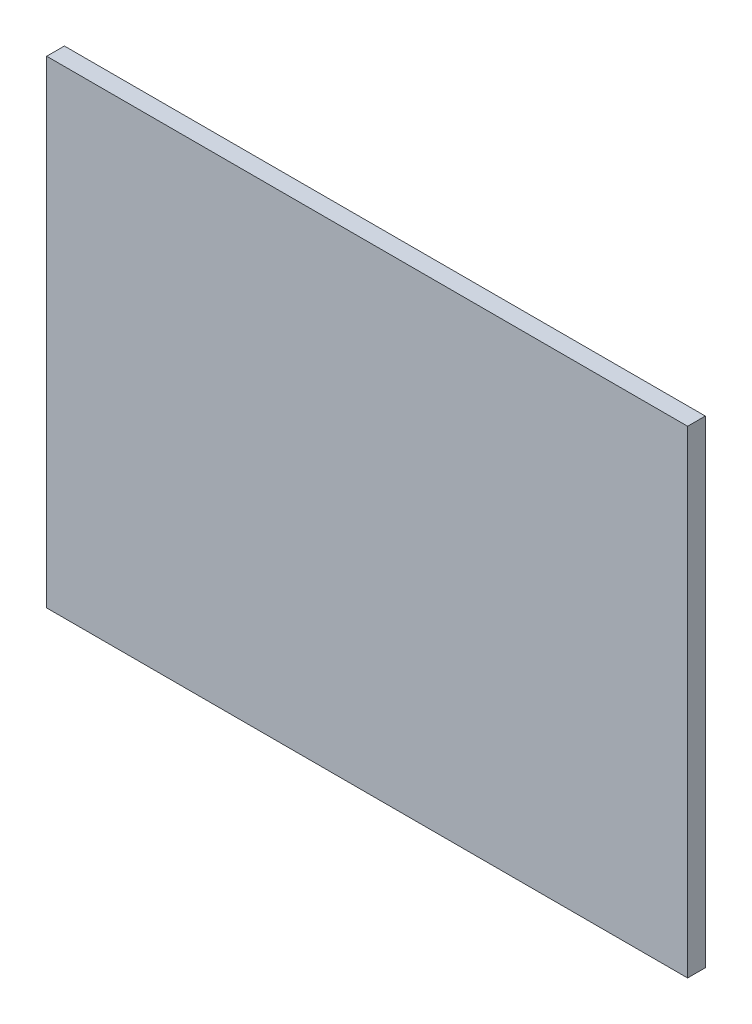
ISO-10303-21;
HEADER;
FILE_DESCRIPTION(('STEP AP214'),'2;1');
FILE_NAME('part.step','',(''),(''),'','','');
FILE_SCHEMA(('AUTOMOTIVE_DESIGN { 1 0 10303 214 1 1 1 1 }'));
ENDSEC;
DATA;
#1=APPLICATION_CONTEXT('core data for automotive mechanical design processes');
#2=APPLICATION_PROTOCOL_DEFINITION('international standard','automotive_design',2000,#1);
#3=PRODUCT_CONTEXT('',#1,'mechanical');
#4=PRODUCT('Part','Part','',(#3));
#5=PRODUCT_RELATED_PRODUCT_CATEGORY('part','',(#4));
#6=PRODUCT_DEFINITION_FORMATION('','',#4);
#7=PRODUCT_DEFINITION_CONTEXT('part definition',#1,'design');
#8=PRODUCT_DEFINITION('design','',#6,#7);
#9=PRODUCT_DEFINITION_SHAPE('','',#8);
#10=(LENGTH_UNIT() NAMED_UNIT(*) SI_UNIT(.MILLI.,.METRE.));
#11=(NAMED_UNIT(*) PLANE_ANGLE_UNIT() SI_UNIT($,.RADIAN.));
#12=(NAMED_UNIT(*) SI_UNIT($,.STERADIAN.) SOLID_ANGLE_UNIT());
#13=UNCERTAINTY_MEASURE_WITH_UNIT(LENGTH_MEASURE(1.E-05),#10,'distance_accuracy_value','');
#14=(GEOMETRIC_REPRESENTATION_CONTEXT(3) GLOBAL_UNCERTAINTY_ASSIGNED_CONTEXT((#13)) GLOBAL_UNIT_ASSIGNED_CONTEXT((#10,
#11,#12)) REPRESENTATION_CONTEXT('',''));
#15=CARTESIAN_POINT('',(0.,0.,0.));
#16=DIRECTION('',(0.,0.,1.));
#17=DIRECTION('',(1.,0.,0.));
#18=AXIS2_PLACEMENT_3D('',#15,#16,#17);
#19=CARTESIAN_POINT('',(90.6194739119687,-15.875,6.35));
#20=DIRECTION('',(-1.,0.,0.));
#21=DIRECTION('',(0.,-1.,0.));
#22=AXIS2_PLACEMENT_3D('',#19,#20,#21);
#23=PLANE('',#22);
#24=DIRECTION('',(0.,1.,0.));
#25=VECTOR('',#24,1.);
#26=CARTESIAN_POINT('',(90.6194739119687,-15.875,0.));
#27=LINE('',#26,#25);
#28=CARTESIAN_POINT('',(90.6194739119687,-15.875,0.));
#29=VERTEX_POINT('',#28);
#30=CARTESIAN_POINT('',(90.6194739119686,155.575,0.));
#31=VERTEX_POINT('',#30);
#32=EDGE_CURVE('E96',#29,#31,#27,.T.);
#33=ORIENTED_EDGE('',*,*,#32,.T.);
#34=DIRECTION('',(0.,0.,-1.));
#35=VECTOR('',#34,1.);
#36=CARTESIAN_POINT('',(90.6194739119686,155.575,6.35));
#37=LINE('',#36,#35);
#38=CARTESIAN_POINT('',(90.6194739119686,155.575,6.35));
#39=VERTEX_POINT('',#38);
#40=EDGE_CURVE('E11',#39,#31,#37,.T.);
#41=ORIENTED_EDGE('',*,*,#40,.F.);
#42=DIRECTION('',(0.,1.,0.));
#43=VECTOR('',#42,1.);
#44=CARTESIAN_POINT('',(90.6194739119687,-15.875,6.35));
#45=LINE('',#44,#43);
#46=CARTESIAN_POINT('',(90.6194739119687,-15.875,6.35));
#47=VERTEX_POINT('',#46);
#48=EDGE_CURVE('E84',#47,#39,#45,.T.);
#49=ORIENTED_EDGE('',*,*,#48,.F.);
#50=DIRECTION('',(0.,0.,-1.));
#51=VECTOR('',#50,1.);
#52=CARTESIAN_POINT('',(90.6194739119687,-15.875,6.35));
#53=LINE('',#52,#51);
#54=EDGE_CURVE('E92',#47,#29,#53,.T.);
#55=ORIENTED_EDGE('',*,*,#54,.T.);
#56=EDGE_LOOP('',(#33,#41,#49,#55));
#57=FACE_BOUND('',#56,.T.);
#58=ADVANCED_FACE('F33',(#57),#23,.F.);
#59=CARTESIAN_POINT('',(90.6194739119686,155.575,6.35));
#60=DIRECTION('',(0.,-1.,0.));
#61=DIRECTION('',(1.,0.,0.));
#62=AXIS2_PLACEMENT_3D('',#59,#60,#61);
#63=PLANE('',#62);
#64=DIRECTION('',(-1.,0.,0.));
#65=VECTOR('',#64,1.);
#66=CARTESIAN_POINT('',(90.6194739119686,155.575,0.));
#67=LINE('',#66,#65);
#68=CARTESIAN_POINT('',(-139.349884677061,155.575,0.));
#69=VERTEX_POINT('',#68);
#70=EDGE_CURVE('E88',#31,#69,#67,.T.);
#71=ORIENTED_EDGE('',*,*,#70,.T.);
#72=DIRECTION('',(0.,0.,-1.));
#73=VECTOR('',#72,1.);
#74=CARTESIAN_POINT('',(-139.349884677061,155.575,6.35));
#75=LINE('',#74,#73);
#76=CARTESIAN_POINT('',(-139.349884677061,155.575,6.35));
#77=VERTEX_POINT('',#76);
#78=EDGE_CURVE('E41',#77,#69,#75,.T.);
#79=ORIENTED_EDGE('',*,*,#78,.F.);
#80=DIRECTION('',(-1.,0.,0.));
#81=VECTOR('',#80,1.);
#82=CARTESIAN_POINT('',(90.6194739119686,155.575,6.35));
#83=LINE('',#82,#81);
#84=EDGE_CURVE('E79',#39,#77,#83,.T.);
#85=ORIENTED_EDGE('',*,*,#84,.F.);
#86=ORIENTED_EDGE('',*,*,#40,.T.);
#87=EDGE_LOOP('',(#71,#79,#85,#86));
#88=FACE_BOUND('',#87,.T.);
#89=ADVANCED_FACE('F87',(#88),#63,.F.);
#90=CARTESIAN_POINT('',(-139.349884677061,-15.875,6.35));
#91=DIRECTION('',(1.,0.,0.));
#92=DIRECTION('',(0.,1.,0.));
#93=AXIS2_PLACEMENT_3D('',#90,#91,#92);
#94=PLANE('',#93);
#95=DIRECTION('',(0.,-1.,0.));
#96=VECTOR('',#95,1.);
#97=CARTESIAN_POINT('',(-139.349884677061,-15.875,0.));
#98=LINE('',#97,#96);
#99=CARTESIAN_POINT('',(-139.349884677061,-15.875,0.));
#100=VERTEX_POINT('',#99);
#101=EDGE_CURVE('E66',#69,#100,#98,.T.);
#102=ORIENTED_EDGE('',*,*,#101,.T.);
#103=DIRECTION('',(0.,0.,-1.));
#104=VECTOR('',#103,1.);
#105=CARTESIAN_POINT('',(-139.349884677061,-15.875,6.35));
#106=LINE('',#105,#104);
#107=CARTESIAN_POINT('',(-139.349884677061,-15.875,6.35));
#108=VERTEX_POINT('',#107);
#109=EDGE_CURVE('E89',#108,#100,#106,.T.);
#110=ORIENTED_EDGE('',*,*,#109,.F.);
#111=DIRECTION('',(0.,-1.,0.));
#112=VECTOR('',#111,1.);
#113=CARTESIAN_POINT('',(-139.349884677061,-15.875,6.35));
#114=LINE('',#113,#112);
#115=EDGE_CURVE('E82',#77,#108,#114,.T.);
#116=ORIENTED_EDGE('',*,*,#115,.F.);
#117=ORIENTED_EDGE('',*,*,#78,.T.);
#118=EDGE_LOOP('',(#102,#110,#116,#117));
#119=FACE_BOUND('',#118,.T.);
#120=ADVANCED_FACE('F90',(#119),#94,.F.);
#121=CARTESIAN_POINT('',(90.6194739119687,-15.875,6.35));
#122=DIRECTION('',(0.,1.,0.));
#123=DIRECTION('',(-1.,0.,0.));
#124=AXIS2_PLACEMENT_3D('',#121,#122,#123);
#125=PLANE('',#124);
#126=DIRECTION('',(1.,0.,0.));
#127=VECTOR('',#126,1.);
#128=CARTESIAN_POINT('',(90.6194739119687,-15.875,0.));
#129=LINE('',#128,#127);
#130=EDGE_CURVE('E72',#100,#29,#129,.T.);
#131=ORIENTED_EDGE('',*,*,#130,.T.);
#132=ORIENTED_EDGE('',*,*,#54,.F.);
#133=DIRECTION('',(1.,0.,0.));
#134=VECTOR('',#133,1.);
#135=CARTESIAN_POINT('',(90.6194739119687,-15.875,6.35));
#136=LINE('',#135,#134);
#137=EDGE_CURVE('E49',#108,#47,#136,.T.);
#138=ORIENTED_EDGE('',*,*,#137,.F.);
#139=ORIENTED_EDGE('',*,*,#109,.T.);
#140=EDGE_LOOP('',(#131,#132,#138,#139));
#141=FACE_BOUND('',#140,.T.);
#142=ADVANCED_FACE('F103',(#141),#125,.F.);
#143=CARTESIAN_POINT('',(0.,0.,6.35));
#144=DIRECTION('',(0.,0.,1.));
#145=DIRECTION('',(1.,0.,0.));
#146=AXIS2_PLACEMENT_3D('',#143,#144,#145);
#147=PLANE('',#146);
#148=ORIENTED_EDGE('',*,*,#48,.T.);
#149=ORIENTED_EDGE('',*,*,#84,.T.);
#150=ORIENTED_EDGE('',*,*,#115,.T.);
#151=ORIENTED_EDGE('',*,*,#137,.T.);
#152=EDGE_LOOP('',(#148,#149,#150,#151));
#153=FACE_BOUND('',#152,.T.);
#154=ADVANCED_FACE('F80',(#153),#147,.T.);
#155=CARTESIAN_POINT('',(0.,0.,0.));
#156=DIRECTION('',(0.,0.,1.));
#157=DIRECTION('',(1.,0.,0.));
#158=AXIS2_PLACEMENT_3D('',#155,#156,#157);
#159=PLANE('',#158);
#160=ORIENTED_EDGE('',*,*,#32,.F.);
#161=ORIENTED_EDGE('',*,*,#130,.F.);
#162=ORIENTED_EDGE('',*,*,#101,.F.);
#163=ORIENTED_EDGE('',*,*,#70,.F.);
#164=EDGE_LOOP('',(#160,#161,#162,#163));
#165=FACE_BOUND('',#164,.T.);
#166=ADVANCED_FACE('F106',(#165),#159,.F.);
#167=CLOSED_SHELL('',(#58,#89,#120,#142,#154,#166));
#168=MANIFOLD_SOLID_BREP('B2',#167);
#169=ADVANCED_BREP_SHAPE_REPRESENTATION('',(#18,#168),#14);
#170=SHAPE_DEFINITION_REPRESENTATION(#9,#169);
ENDSEC;
END-ISO-10303-21;
